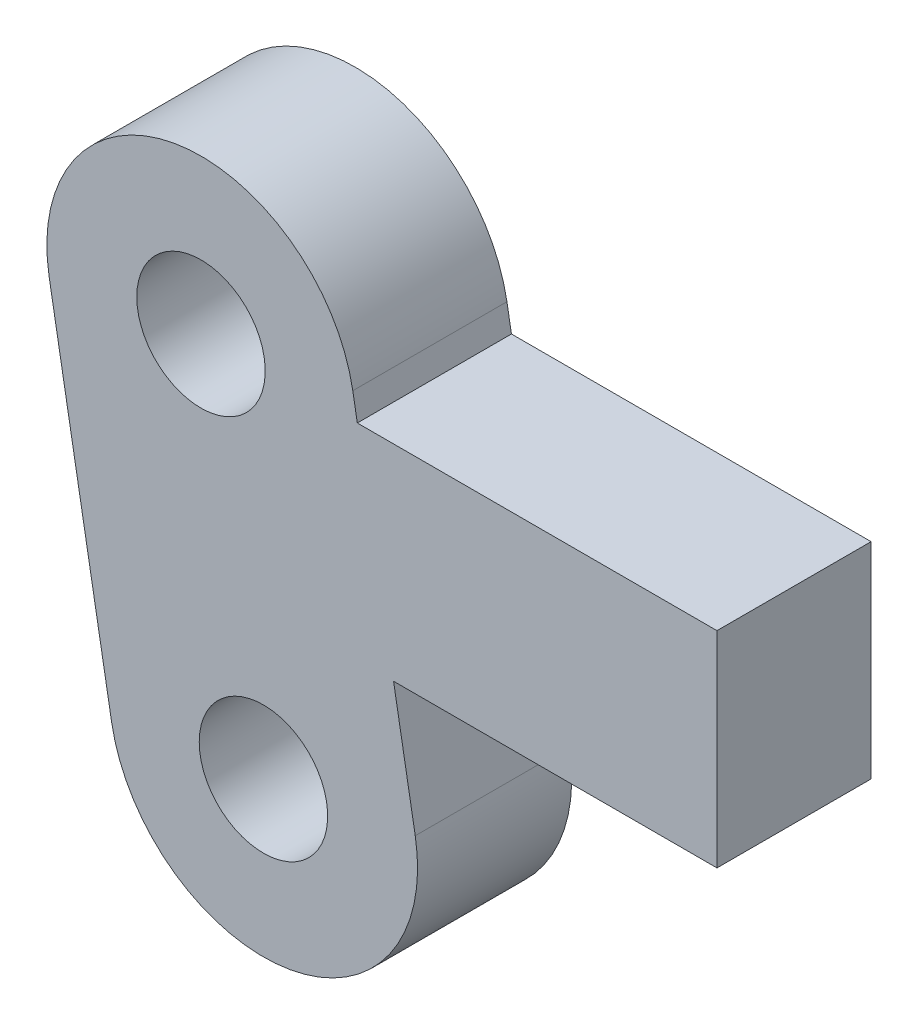
ISO-10303-21;
HEADER;
FILE_DESCRIPTION(('STEP AP214'),'2;1');
FILE_NAME('part.step','',(''),(''),'','','');
FILE_SCHEMA(('AUTOMOTIVE_DESIGN { 1 0 10303 214 1 1 1 1 }'));
ENDSEC;
DATA;
#1=APPLICATION_CONTEXT('core data for automotive mechanical design processes');
#2=APPLICATION_PROTOCOL_DEFINITION('international standard','automotive_design',2000,#1);
#3=PRODUCT_CONTEXT('',#1,'mechanical');
#4=PRODUCT('Part','Part','',(#3));
#5=PRODUCT_RELATED_PRODUCT_CATEGORY('part','',(#4));
#6=PRODUCT_DEFINITION_FORMATION('','',#4);
#7=PRODUCT_DEFINITION_CONTEXT('part definition',#1,'design');
#8=PRODUCT_DEFINITION('design','',#6,#7);
#9=PRODUCT_DEFINITION_SHAPE('','',#8);
#10=(LENGTH_UNIT() NAMED_UNIT(*) SI_UNIT(.MILLI.,.METRE.));
#11=(NAMED_UNIT(*) PLANE_ANGLE_UNIT() SI_UNIT($,.RADIAN.));
#12=(NAMED_UNIT(*) SI_UNIT($,.STERADIAN.) SOLID_ANGLE_UNIT());
#13=UNCERTAINTY_MEASURE_WITH_UNIT(LENGTH_MEASURE(1.E-05),#10,'distance_accuracy_value','');
#14=(GEOMETRIC_REPRESENTATION_CONTEXT(3) GLOBAL_UNCERTAINTY_ASSIGNED_CONTEXT((#13)) GLOBAL_UNIT_ASSIGNED_CONTEXT((#10,
#11,#12)) REPRESENTATION_CONTEXT('',''));
#15=CARTESIAN_POINT('',(0.,0.,0.));
#16=DIRECTION('',(0.,0.,1.));
#17=DIRECTION('',(1.,0.,0.));
#18=AXIS2_PLACEMENT_3D('',#15,#16,#17);
#19=CARTESIAN_POINT('',(18.8982385921882,3.33226935166871,4.));
#20=DIRECTION('',(-0.984807753012208,-0.173648177666929,0.));
#21=DIRECTION('',(0.173648177666929,-0.984807753012208,0.));
#22=AXIS2_PLACEMENT_3D('',#19,#20,#21);
#23=PLANE('',#22);
#24=DIRECTION('',(0.,0.,-1.));
#25=VECTOR('',#24,1.);
#26=CARTESIAN_POINT('',(18.8786893579488,3.44313856839815,15.0622577482986));
#27=LINE('',#26,#25);
#28=CARTESIAN_POINT('',(18.8786893579488,3.44313856839815,7.));
#29=VERTEX_POINT('',#28);
#30=CARTESIAN_POINT('',(18.8786893579488,3.44313856839815,4.));
#31=VERTEX_POINT('',#30);
#32=EDGE_CURVE('E136',#29,#31,#27,.T.);
#33=ORIENTED_EDGE('',*,*,#32,.F.);
#34=DIRECTION('',(0.173648177666929,-0.984807753012208,0.));
#35=VECTOR('',#34,1.);
#36=CARTESIAN_POINT('',(18.8982385921882,3.33226935166871,7.));
#37=LINE('',#36,#35);
#38=CARTESIAN_POINT('',(19.3007551884292,1.0494842973127,7.));
#39=VERTEX_POINT('',#38);
#40=EDGE_CURVE('E163',#29,#39,#37,.T.);
#41=ORIENTED_EDGE('',*,*,#40,.T.);
#42=DIRECTION('',(0.,0.,1.));
#43=VECTOR('',#42,1.);
#44=CARTESIAN_POINT('',(19.3007551884292,1.0494842973127,4.));
#45=LINE('',#44,#43);
#46=CARTESIAN_POINT('',(19.3007551884292,1.0494842973127,4.));
#47=VERTEX_POINT('',#46);
#48=EDGE_CURVE('E169',#47,#39,#45,.T.);
#49=ORIENTED_EDGE('',*,*,#48,.F.);
#50=DIRECTION('',(0.173648177666929,-0.984807753012208,0.));
#51=VECTOR('',#50,1.);
#52=CARTESIAN_POINT('',(18.8982385921882,3.33226935166871,4.));
#53=LINE('',#52,#51);
#54=EDGE_CURVE('E54',#31,#47,#53,.T.);
#55=ORIENTED_EDGE('',*,*,#54,.F.);
#56=EDGE_LOOP('',(#33,#41,#49,#55));
#57=FACE_BOUND('',#56,.T.);
#58=ADVANCED_FACE('F37',(#57),#23,.F.);
#59=CARTESIAN_POINT('',(12.9893920741149,2.29038028566714,4.));
#60=DIRECTION('',(-0.984807753012208,-0.17364817766693,0.));
#61=DIRECTION('',(0.17364817766693,-0.984807753012208,0.));
#62=AXIS2_PLACEMENT_3D('',#59,#60,#61);
#63=PLANE('',#62);
#64=DIRECTION('',(0.17364817766693,-0.984807753012208,0.));
#65=VECTOR('',#64,1.);
#66=CARTESIAN_POINT('',(12.9893920741149,2.29038028566714,7.));
#67=LINE('',#66,#65);
#68=CARTESIAN_POINT('',(12.1763714266874,6.90124950239657,7.));
#69=VERTEX_POINT('',#68);
#70=CARTESIAN_POINT('',(13.3919086703559,0.0075952313111175,7.));
#71=VERTEX_POINT('',#70);
#72=EDGE_CURVE('E158',#69,#71,#67,.T.);
#73=ORIENTED_EDGE('',*,*,#72,.F.);
#74=DIRECTION('',(0.,0.,1.));
#75=VECTOR('',#74,1.);
#76=CARTESIAN_POINT('',(12.1763714266874,6.90124950239657,4.));
#77=LINE('',#76,#75);
#78=CARTESIAN_POINT('',(12.1763714266874,6.90124950239657,4.));
#79=VERTEX_POINT('',#78);
#80=EDGE_CURVE('E11',#79,#69,#77,.T.);
#81=ORIENTED_EDGE('',*,*,#80,.F.);
#82=DIRECTION('',(0.17364817766693,-0.984807753012208,0.));
#83=VECTOR('',#82,1.);
#84=CARTESIAN_POINT('',(12.9893920741149,2.29038028566714,4.));
#85=LINE('',#84,#83);
#86=CARTESIAN_POINT('',(13.3919086703559,0.0075952313111175,4.));
#87=VERTEX_POINT('',#86);
#88=EDGE_CURVE('E148',#79,#87,#85,.T.);
#89=ORIENTED_EDGE('',*,*,#88,.T.);
#90=DIRECTION('',(0.,0.,1.));
#91=VECTOR('',#90,1.);
#92=CARTESIAN_POINT('',(13.3919086703559,0.0075952313111175,4.));
#93=LINE('',#92,#91);
#94=EDGE_CURVE('E157',#87,#71,#93,.T.);
#95=ORIENTED_EDGE('',*,*,#94,.T.);
#96=EDGE_LOOP('',(#73,#81,#89,#95));
#97=FACE_BOUND('',#96,.T.);
#98=ADVANCED_FACE('F39',(#97),#63,.T.);
#99=CARTESIAN_POINT('',(15.130794685724,7.42219403539736,4.));
#100=DIRECTION('',(0.,0.,1.));
#101=DIRECTION('',(1.,0.,0.));
#102=AXIS2_PLACEMENT_3D('',#99,#100,#101);
#103=CYLINDRICAL_SURFACE('',#102,2.99999999999998);
#104=CARTESIAN_POINT('',(15.130794685724,7.42219403539736,7.));
#105=DIRECTION('',(0.,0.,-1.));
#106=DIRECTION('',(-1.,0.,0.));
#107=AXIS2_PLACEMENT_3D('',#104,#105,#106);
#108=CIRCLE('',#107,2.99999999999998);
#109=CARTESIAN_POINT('',(18.0852179447607,7.94313856839815,7.));
#110=VERTEX_POINT('',#109);
#111=EDGE_CURVE('E161',#69,#110,#108,.T.);
#112=ORIENTED_EDGE('',*,*,#111,.T.);
#113=DIRECTION('',(0.,0.,1.));
#114=VECTOR('',#113,1.);
#115=CARTESIAN_POINT('',(18.0852179447607,7.94313856839815,4.));
#116=LINE('',#115,#114);
#117=CARTESIAN_POINT('',(18.0852179447607,7.94313856839815,4.));
#118=VERTEX_POINT('',#117);
#119=EDGE_CURVE('E46',#118,#110,#116,.T.);
#120=ORIENTED_EDGE('',*,*,#119,.F.);
#121=CARTESIAN_POINT('',(15.130794685724,7.42219403539736,4.));
#122=DIRECTION('',(0.,0.,-1.));
#123=DIRECTION('',(-1.,0.,0.));
#124=AXIS2_PLACEMENT_3D('',#121,#122,#123);
#125=CIRCLE('',#124,2.99999999999998);
#126=EDGE_CURVE('E151',#79,#118,#125,.T.);
#127=ORIENTED_EDGE('',*,*,#126,.F.);
#128=ORIENTED_EDGE('',*,*,#80,.T.);
#129=EDGE_LOOP('',(#112,#120,#127,#128));
#130=FACE_BOUND('',#129,.T.);
#131=ADVANCED_FACE('F199',(#130),#103,.T.);
#132=CARTESIAN_POINT('',(18.1733814351149,7.44313856839815,7.));
#133=VERTEX_POINT('',#132);
#134=EDGE_CURVE('E164',#110,#133,#37,.T.);
#135=ORIENTED_EDGE('',*,*,#134,.T.);
#136=DIRECTION('',(0.,0.,-1.));
#137=VECTOR('',#136,1.);
#138=CARTESIAN_POINT('',(18.1733814351149,7.44313856839815,15.0622577482986));
#139=LINE('',#138,#137);
#140=CARTESIAN_POINT('',(18.1733814351149,7.44313856839815,4.));
#141=VERTEX_POINT('',#140);
#142=EDGE_CURVE('E62',#133,#141,#139,.T.);
#143=ORIENTED_EDGE('',*,*,#142,.T.);
#144=EDGE_CURVE('E128',#118,#141,#53,.T.);
#145=ORIENTED_EDGE('',*,*,#144,.F.);
#146=ORIENTED_EDGE('',*,*,#119,.T.);
#147=EDGE_LOOP('',(#135,#143,#145,#146));
#148=FACE_BOUND('',#147,.T.);
#149=ADVANCED_FACE('F195',(#148),#23,.F.);
#150=CARTESIAN_POINT('',(16.3463319293926,0.528539764311909,4.));
#151=DIRECTION('',(0.,0.,1.));
#152=DIRECTION('',(1.,0.,0.));
#153=AXIS2_PLACEMENT_3D('',#150,#151,#152);
#154=CYLINDRICAL_SURFACE('',#153,3.);
#155=CARTESIAN_POINT('',(16.3463319293926,0.528539764311909,7.));
#156=DIRECTION('',(0.,0.,-1.));
#157=DIRECTION('',(-1.,0.,0.));
#158=AXIS2_PLACEMENT_3D('',#155,#156,#157);
#159=CIRCLE('',#158,3.);
#160=EDGE_CURVE('E152',#39,#71,#159,.T.);
#161=ORIENTED_EDGE('',*,*,#160,.T.);
#162=ORIENTED_EDGE('',*,*,#94,.F.);
#163=CARTESIAN_POINT('',(16.3463319293926,0.528539764311909,4.));
#164=DIRECTION('',(0.,0.,-1.));
#165=DIRECTION('',(-1.,0.,0.));
#166=AXIS2_PLACEMENT_3D('',#163,#164,#165);
#167=CIRCLE('',#166,3.);
#168=EDGE_CURVE('E155',#47,#87,#167,.T.);
#169=ORIENTED_EDGE('',*,*,#168,.F.);
#170=ORIENTED_EDGE('',*,*,#48,.T.);
#171=EDGE_LOOP('',(#161,#162,#169,#170));
#172=FACE_BOUND('',#171,.T.);
#173=ADVANCED_FACE('F203',(#172),#154,.T.);
#174=CARTESIAN_POINT('',(0.,0.,4.));
#175=DIRECTION('',(0.,0.,-1.));
#176=DIRECTION('',(-1.,0.,0.));
#177=AXIS2_PLACEMENT_3D('',#174,#175,#176);
#178=PLANE('',#177);
#179=CARTESIAN_POINT('',(16.3463319293926,0.528539764311909,4.));
#180=DIRECTION('',(0.,0.,-1.));
#181=DIRECTION('',(-1.,0.,0.));
#182=AXIS2_PLACEMENT_3D('',#179,#180,#181);
#183=CIRCLE('',#182,1.25);
#184=CARTESIAN_POINT('',(15.0963319293926,0.528539764311909,4.));
#185=VERTEX_POINT('',#184);
#186=EDGE_CURVE('E141',#185,#185,#183,.T.);
#187=ORIENTED_EDGE('',*,*,#186,.F.);
#188=EDGE_LOOP('',(#187));
#189=FACE_BOUND('',#188,.T.);
#190=CARTESIAN_POINT('',(15.130794685724,7.42219403539736,4.));
#191=DIRECTION('',(0.,0.,-1.));
#192=DIRECTION('',(-1.,0.,0.));
#193=AXIS2_PLACEMENT_3D('',#190,#191,#192);
#194=CIRCLE('',#193,1.25);
#195=CARTESIAN_POINT('',(13.880794685724,7.42219403539736,4.));
#196=VERTEX_POINT('',#195);
#197=EDGE_CURVE('E144',#196,#196,#194,.T.);
#198=ORIENTED_EDGE('',*,*,#197,.F.);
#199=EDGE_LOOP('',(#198));
#200=FACE_BOUND('',#199,.T.);
#201=ORIENTED_EDGE('',*,*,#88,.F.);
#202=ORIENTED_EDGE('',*,*,#126,.T.);
#203=ORIENTED_EDGE('',*,*,#144,.T.);
#204=DIRECTION('',(1.,0.,0.));
#205=VECTOR('',#204,1.);
#206=CARTESIAN_POINT('',(0.,7.44313856839815,4.));
#207=LINE('',#206,#205);
#208=CARTESIAN_POINT('',(25.1733814351149,7.44313856839815,4.));
#209=VERTEX_POINT('',#208);
#210=EDGE_CURVE('E110',#141,#209,#207,.T.);
#211=ORIENTED_EDGE('',*,*,#210,.T.);
#212=DIRECTION('',(0.,-1.,0.));
#213=VECTOR('',#212,1.);
#214=CARTESIAN_POINT('',(25.1733814351149,0.,4.));
#215=LINE('',#214,#213);
#216=CARTESIAN_POINT('',(25.1733814351149,3.44313856839815,4.));
#217=VERTEX_POINT('',#216);
#218=EDGE_CURVE('E119',#209,#217,#215,.T.);
#219=ORIENTED_EDGE('',*,*,#218,.T.);
#220=DIRECTION('',(1.,0.,0.));
#221=VECTOR('',#220,1.);
#222=CARTESIAN_POINT('',(0.,3.44313856839816,4.));
#223=LINE('',#222,#221);
#224=EDGE_CURVE('E116',#31,#217,#223,.T.);
#225=ORIENTED_EDGE('',*,*,#224,.F.);
#226=ORIENTED_EDGE('',*,*,#54,.T.);
#227=ORIENTED_EDGE('',*,*,#168,.T.);
#228=EDGE_LOOP('',(#201,#202,#203,#211,#219,#225,#226,#227));
#229=FACE_BOUND('',#228,.T.);
#230=ADVANCED_FACE('F127',(#189,#200,#229),#178,.T.);
#231=CARTESIAN_POINT('',(0.,0.,7.));
#232=DIRECTION('',(0.,0.,-1.));
#233=DIRECTION('',(-1.,0.,0.));
#234=AXIS2_PLACEMENT_3D('',#231,#232,#233);
#235=PLANE('',#234);
#236=CARTESIAN_POINT('',(16.3463319293926,0.528539764311909,7.));
#237=DIRECTION('',(0.,0.,-1.));
#238=DIRECTION('',(-1.,0.,0.));
#239=AXIS2_PLACEMENT_3D('',#236,#237,#238);
#240=CIRCLE('',#239,1.25);
#241=CARTESIAN_POINT('',(15.0963319293926,0.528539764311909,7.));
#242=VERTEX_POINT('',#241);
#243=EDGE_CURVE('E41',#242,#242,#240,.T.);
#244=ORIENTED_EDGE('',*,*,#243,.T.);
#245=EDGE_LOOP('',(#244));
#246=FACE_BOUND('',#245,.T.);
#247=CARTESIAN_POINT('',(15.130794685724,7.42219403539736,7.));
#248=DIRECTION('',(0.,0.,-1.));
#249=DIRECTION('',(-1.,0.,0.));
#250=AXIS2_PLACEMENT_3D('',#247,#248,#249);
#251=CIRCLE('',#250,1.25);
#252=CARTESIAN_POINT('',(13.880794685724,7.42219403539736,7.));
#253=VERTEX_POINT('',#252);
#254=EDGE_CURVE('E147',#253,#253,#251,.T.);
#255=ORIENTED_EDGE('',*,*,#254,.T.);
#256=EDGE_LOOP('',(#255));
#257=FACE_BOUND('',#256,.T.);
#258=ORIENTED_EDGE('',*,*,#72,.T.);
#259=ORIENTED_EDGE('',*,*,#160,.F.);
#260=ORIENTED_EDGE('',*,*,#40,.F.);
#261=DIRECTION('',(-1.,0.,0.));
#262=VECTOR('',#261,1.);
#263=CARTESIAN_POINT('',(0.,3.44313856839816,7.));
#264=LINE('',#263,#262);
#265=CARTESIAN_POINT('',(25.1733814351149,3.44313856839815,7.));
#266=VERTEX_POINT('',#265);
#267=EDGE_CURVE('E135',#266,#29,#264,.T.);
#268=ORIENTED_EDGE('',*,*,#267,.F.);
#269=DIRECTION('',(0.,1.,0.));
#270=VECTOR('',#269,1.);
#271=CARTESIAN_POINT('',(25.1733814351149,0.,7.));
#272=LINE('',#271,#270);
#273=CARTESIAN_POINT('',(25.1733814351149,7.44313856839815,7.));
#274=VERTEX_POINT('',#273);
#275=EDGE_CURVE('E139',#266,#274,#272,.T.);
#276=ORIENTED_EDGE('',*,*,#275,.T.);
#277=DIRECTION('',(-1.,0.,0.));
#278=VECTOR('',#277,1.);
#279=CARTESIAN_POINT('',(0.,7.44313856839815,7.));
#280=LINE('',#279,#278);
#281=EDGE_CURVE('E112',#274,#133,#280,.T.);
#282=ORIENTED_EDGE('',*,*,#281,.T.);
#283=ORIENTED_EDGE('',*,*,#134,.F.);
#284=ORIENTED_EDGE('',*,*,#111,.F.);
#285=EDGE_LOOP('',(#258,#259,#260,#268,#276,#282,#283,#284));
#286=FACE_BOUND('',#285,.T.);
#287=ADVANCED_FACE('F176',(#246,#257,#286),#235,.F.);
#288=CARTESIAN_POINT('',(15.130794685724,7.42219403539736,10.));
#289=DIRECTION('',(0.,0.,-1.));
#290=DIRECTION('',(-1.,0.,0.));
#291=AXIS2_PLACEMENT_3D('',#288,#289,#290);
#292=CYLINDRICAL_SURFACE('',#291,1.25);
#293=ORIENTED_EDGE('',*,*,#197,.T.);
#294=EDGE_LOOP('',(#293));
#295=FACE_BOUND('',#294,.T.);
#296=ORIENTED_EDGE('',*,*,#254,.F.);
#297=EDGE_LOOP('',(#296));
#298=FACE_BOUND('',#297,.T.);
#299=ADVANCED_FACE('F179',(#295,#298),#292,.F.);
#300=CARTESIAN_POINT('',(16.3463319293926,0.528539764311909,10.));
#301=DIRECTION('',(0.,0.,-1.));
#302=DIRECTION('',(-1.,0.,0.));
#303=AXIS2_PLACEMENT_3D('',#300,#301,#302);
#304=CYLINDRICAL_SURFACE('',#303,1.25);
#305=ORIENTED_EDGE('',*,*,#186,.T.);
#306=EDGE_LOOP('',(#305));
#307=FACE_BOUND('',#306,.T.);
#308=ORIENTED_EDGE('',*,*,#243,.F.);
#309=EDGE_LOOP('',(#308));
#310=FACE_BOUND('',#309,.T.);
#311=ADVANCED_FACE('F181',(#307,#310),#304,.F.);
#312=CARTESIAN_POINT('',(0.,7.44313856839815,15.0622577482986));
#313=DIRECTION('',(0.,1.,0.));
#314=DIRECTION('',(0.,0.,1.));
#315=AXIS2_PLACEMENT_3D('',#312,#313,#314);
#316=PLANE('',#315);
#317=ORIENTED_EDGE('',*,*,#281,.F.);
#318=DIRECTION('',(0.,0.,-1.));
#319=VECTOR('',#318,1.);
#320=CARTESIAN_POINT('',(25.1733814351149,7.44313856839815,15.0622577482986));
#321=LINE('',#320,#319);
#322=EDGE_CURVE('E106',#274,#209,#321,.T.);
#323=ORIENTED_EDGE('',*,*,#322,.T.);
#324=ORIENTED_EDGE('',*,*,#210,.F.);
#325=ORIENTED_EDGE('',*,*,#142,.F.);
#326=EDGE_LOOP('',(#317,#323,#324,#325));
#327=FACE_BOUND('',#326,.T.);
#328=ADVANCED_FACE('F108',(#327),#316,.T.);
#329=CARTESIAN_POINT('',(0.,3.44313856839816,15.0622577482986));
#330=DIRECTION('',(0.,1.,0.));
#331=DIRECTION('',(-1.,0.,0.));
#332=AXIS2_PLACEMENT_3D('',#329,#330,#331);
#333=PLANE('',#332);
#334=DIRECTION('',(0.,0.,-1.));
#335=VECTOR('',#334,1.);
#336=CARTESIAN_POINT('',(25.1733814351149,3.44313856839815,15.0622577482986));
#337=LINE('',#336,#335);
#338=EDGE_CURVE('E115',#266,#217,#337,.T.);
#339=ORIENTED_EDGE('',*,*,#338,.F.);
#340=ORIENTED_EDGE('',*,*,#267,.T.);
#341=ORIENTED_EDGE('',*,*,#32,.T.);
#342=ORIENTED_EDGE('',*,*,#224,.T.);
#343=EDGE_LOOP('',(#339,#340,#341,#342));
#344=FACE_BOUND('',#343,.T.);
#345=ADVANCED_FACE('F215',(#344),#333,.F.);
#346=CARTESIAN_POINT('',(25.1733814351149,0.,15.0622577482986));
#347=DIRECTION('',(1.,0.,0.));
#348=DIRECTION('',(0.,0.,-1.));
#349=AXIS2_PLACEMENT_3D('',#346,#347,#348);
#350=PLANE('',#349);
#351=ORIENTED_EDGE('',*,*,#275,.F.);
#352=ORIENTED_EDGE('',*,*,#338,.T.);
#353=ORIENTED_EDGE('',*,*,#218,.F.);
#354=ORIENTED_EDGE('',*,*,#322,.F.);
#355=EDGE_LOOP('',(#351,#352,#353,#354));
#356=FACE_BOUND('',#355,.T.);
#357=ADVANCED_FACE('F120',(#356),#350,.T.);
#358=CLOSED_SHELL('',(#58,#98,#131,#149,#173,#230,#287,#299,#311,#328,#345,#357));
#359=MANIFOLD_SOLID_BREP('B2',#358);
#360=ADVANCED_BREP_SHAPE_REPRESENTATION('',(#18,#359),#14);
#361=SHAPE_DEFINITION_REPRESENTATION(#9,#360);
ENDSEC;
END-ISO-10303-21;
